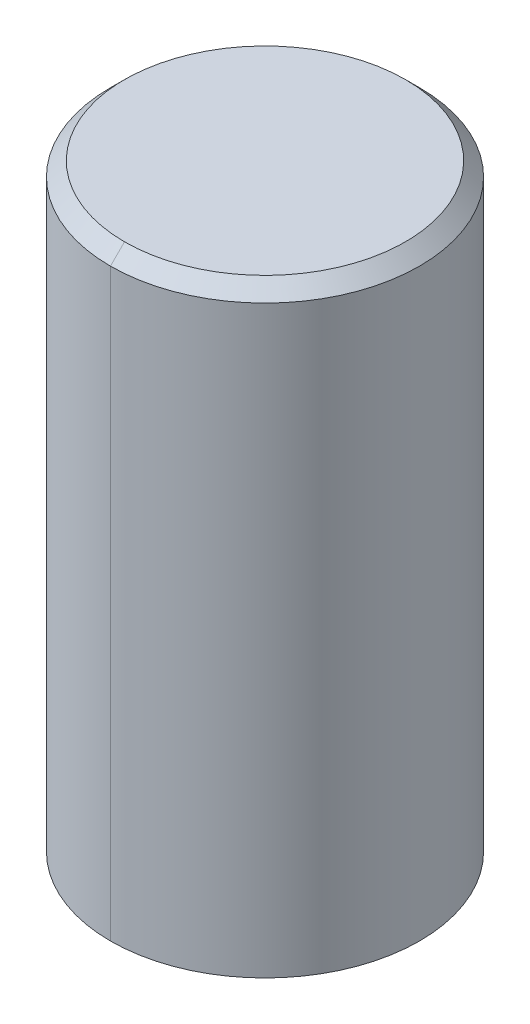
ISO-10303-21;
HEADER;
FILE_DESCRIPTION(('STEP AP214'),'2;1');
FILE_NAME('part.step','',(''),(''),'','','');
FILE_SCHEMA(('AUTOMOTIVE_DESIGN { 1 0 10303 214 1 1 1 1 }'));
ENDSEC;
DATA;
#1=APPLICATION_CONTEXT('core data for automotive mechanical design processes');
#2=APPLICATION_PROTOCOL_DEFINITION('international standard','automotive_design',2000,#1);
#3=PRODUCT_CONTEXT('',#1,'mechanical');
#4=PRODUCT('Part','Part','',(#3));
#5=PRODUCT_RELATED_PRODUCT_CATEGORY('part','',(#4));
#6=PRODUCT_DEFINITION_FORMATION('','',#4);
#7=PRODUCT_DEFINITION_CONTEXT('part definition',#1,'design');
#8=PRODUCT_DEFINITION('design','',#6,#7);
#9=PRODUCT_DEFINITION_SHAPE('','',#8);
#10=(LENGTH_UNIT() NAMED_UNIT(*) SI_UNIT(.MILLI.,.METRE.));
#11=(NAMED_UNIT(*) PLANE_ANGLE_UNIT() SI_UNIT($,.RADIAN.));
#12=(NAMED_UNIT(*) SI_UNIT($,.STERADIAN.) SOLID_ANGLE_UNIT());
#13=UNCERTAINTY_MEASURE_WITH_UNIT(LENGTH_MEASURE(1.E-05),#10,'distance_accuracy_value','');
#14=(GEOMETRIC_REPRESENTATION_CONTEXT(3) GLOBAL_UNCERTAINTY_ASSIGNED_CONTEXT((#13)) GLOBAL_UNIT_ASSIGNED_CONTEXT((#10,
#11,#12)) REPRESENTATION_CONTEXT('',''));
#15=CARTESIAN_POINT('',(0.,0.,0.));
#16=DIRECTION('',(0.,0.,1.));
#17=DIRECTION('',(1.,0.,0.));
#18=AXIS2_PLACEMENT_3D('',#15,#16,#17);
#19=CARTESIAN_POINT('',(0.,5.4102,0.));
#20=DIRECTION('',(0.,-1.,0.));
#21=DIRECTION('',(0.,0.,-1.));
#22=AXIS2_PLACEMENT_3D('',#19,#20,#21);
#23=PLANE('',#22);
#24=CARTESIAN_POINT('',(0.,5.4102,0.));
#25=DIRECTION('',(0.,-1.,0.));
#26=DIRECTION('',(0.,0.,-1.));
#27=AXIS2_PLACEMENT_3D('',#24,#25,#26);
#28=CIRCLE('',#27,1.27);
#29=CARTESIAN_POINT('',(0.,5.4102,1.27));
#30=VERTEX_POINT('',#29);
#31=CARTESIAN_POINT('',(0.,5.4102,-1.27));
#32=VERTEX_POINT('',#31);
#33=EDGE_CURVE('E11',#30,#32,#28,.T.);
#34=ORIENTED_EDGE('',*,*,#33,.F.);
#35=CARTESIAN_POINT('',(0.,5.4102,0.));
#36=DIRECTION('',(0.,-1.,0.));
#37=DIRECTION('',(0.,0.,-1.));
#38=AXIS2_PLACEMENT_3D('',#35,#36,#37);
#39=CIRCLE('',#38,1.27);
#40=EDGE_CURVE('E25',#32,#30,#39,.T.);
#41=ORIENTED_EDGE('',*,*,#40,.F.);
#42=EDGE_LOOP('',(#34,#41));
#43=FACE_BOUND('',#42,.T.);
#44=ADVANCED_FACE('F17',(#43),#23,.F.);
#45=CARTESIAN_POINT('',(0.,5.4102,0.));
#46=DIRECTION('',(0.,-1.,0.));
#47=DIRECTION('',(-1.,0.,0.));
#48=AXIS2_PLACEMENT_3D('',#45,#46,#47);
#49=CONICAL_SURFACE('',#48,1.27,0.78539816339745);
#50=DIRECTION('',(0.,-0.707106781186546,0.707106781186549));
#51=VECTOR('',#50,1.);
#52=CARTESIAN_POINT('',(0.,5.4102,1.27));
#53=LINE('',#52,#51);
#54=CARTESIAN_POINT('',(0.,5.2832,1.397));
#55=VERTEX_POINT('',#54);
#56=EDGE_CURVE('E87',#30,#55,#53,.T.);
#57=ORIENTED_EDGE('',*,*,#56,.T.);
#58=CARTESIAN_POINT('',(0.,5.2832,0.));
#59=DIRECTION('',(0.,-1.,0.));
#60=DIRECTION('',(0.,0.,-1.));
#61=AXIS2_PLACEMENT_3D('',#58,#59,#60);
#62=CIRCLE('',#61,1.397);
#63=CARTESIAN_POINT('',(0.,5.2832,-1.397));
#64=VERTEX_POINT('',#63);
#65=EDGE_CURVE('E63',#64,#55,#62,.T.);
#66=ORIENTED_EDGE('',*,*,#65,.F.);
#67=DIRECTION('',(0.,-0.707106781186546,-0.707106781186549));
#68=VECTOR('',#67,1.);
#69=CARTESIAN_POINT('',(0.,5.4102,-1.27));
#70=LINE('',#69,#68);
#71=EDGE_CURVE('E79',#32,#64,#70,.T.);
#72=ORIENTED_EDGE('',*,*,#71,.F.);
#73=ORIENTED_EDGE('',*,*,#40,.T.);
#74=EDGE_LOOP('',(#57,#66,#72,#73));
#75=FACE_BOUND('',#74,.T.);
#76=ADVANCED_FACE('F96',(#75),#49,.T.);
#77=CARTESIAN_POINT('',(0.,5.4102,0.));
#78=DIRECTION('',(0.,-1.,0.));
#79=DIRECTION('',(1.,0.,0.));
#80=AXIS2_PLACEMENT_3D('',#77,#78,#79);
#81=CONICAL_SURFACE('',#80,1.27,0.78539816339745);
#82=ORIENTED_EDGE('',*,*,#56,.F.);
#83=ORIENTED_EDGE('',*,*,#33,.T.);
#84=ORIENTED_EDGE('',*,*,#71,.T.);
#85=CARTESIAN_POINT('',(0.,5.2832,0.));
#86=DIRECTION('',(0.,-1.,0.));
#87=DIRECTION('',(0.,0.,-1.));
#88=AXIS2_PLACEMENT_3D('',#85,#86,#87);
#89=CIRCLE('',#88,1.397);
#90=EDGE_CURVE('E64',#55,#64,#89,.T.);
#91=ORIENTED_EDGE('',*,*,#90,.F.);
#92=EDGE_LOOP('',(#82,#83,#84,#91));
#93=FACE_BOUND('',#92,.T.);
#94=ADVANCED_FACE('F99',(#93),#81,.T.);
#95=CARTESIAN_POINT('',(0.,0.,0.));
#96=DIRECTION('',(0.,-1.,0.));
#97=DIRECTION('',(1.,0.,0.));
#98=AXIS2_PLACEMENT_3D('',#95,#96,#97);
#99=CYLINDRICAL_SURFACE('',#98,1.397);
#100=DIRECTION('',(0.,-1.,0.));
#101=VECTOR('',#100,1.);
#102=CARTESIAN_POINT('',(0.,5.2832,1.397));
#103=LINE('',#102,#101);
#104=CARTESIAN_POINT('',(0.,0.,1.397));
#105=VERTEX_POINT('',#104);
#106=EDGE_CURVE('E52',#55,#105,#103,.T.);
#107=ORIENTED_EDGE('',*,*,#106,.F.);
#108=ORIENTED_EDGE('',*,*,#90,.T.);
#109=DIRECTION('',(0.,-1.,0.));
#110=VECTOR('',#109,1.);
#111=CARTESIAN_POINT('',(0.,5.2832,-1.397));
#112=LINE('',#111,#110);
#113=CARTESIAN_POINT('',(0.,0.,-1.397));
#114=VERTEX_POINT('',#113);
#115=EDGE_CURVE('E55',#64,#114,#112,.T.);
#116=ORIENTED_EDGE('',*,*,#115,.T.);
#117=CARTESIAN_POINT('',(0.,0.,0.));
#118=DIRECTION('',(0.,-1.,0.));
#119=DIRECTION('',(0.,0.,-1.));
#120=AXIS2_PLACEMENT_3D('',#117,#118,#119);
#121=CIRCLE('',#120,1.397);
#122=EDGE_CURVE('E48',#105,#114,#121,.T.);
#123=ORIENTED_EDGE('',*,*,#122,.F.);
#124=EDGE_LOOP('',(#107,#108,#116,#123));
#125=FACE_BOUND('',#124,.T.);
#126=ADVANCED_FACE('F50',(#125),#99,.T.);
#127=CARTESIAN_POINT('',(1.397,0.,0.));
#128=DIRECTION('',(0.,1.,0.));
#129=DIRECTION('',(0.,0.,1.));
#130=AXIS2_PLACEMENT_3D('',#127,#128,#129);
#131=PLANE('',#130);
#132=CARTESIAN_POINT('',(0.,0.,0.));
#133=DIRECTION('',(0.,-1.,0.));
#134=DIRECTION('',(0.,0.,-1.));
#135=AXIS2_PLACEMENT_3D('',#132,#133,#134);
#136=CIRCLE('',#135,1.397);
#137=EDGE_CURVE('E59',#114,#105,#136,.T.);
#138=ORIENTED_EDGE('',*,*,#137,.T.);
#139=ORIENTED_EDGE('',*,*,#122,.T.);
#140=EDGE_LOOP('',(#138,#139));
#141=FACE_BOUND('',#140,.T.);
#142=ADVANCED_FACE('F66',(#141),#131,.F.);
#143=CARTESIAN_POINT('',(0.,0.,0.));
#144=DIRECTION('',(0.,-1.,0.));
#145=DIRECTION('',(-1.,0.,0.));
#146=AXIS2_PLACEMENT_3D('',#143,#144,#145);
#147=CYLINDRICAL_SURFACE('',#146,1.397);
#148=ORIENTED_EDGE('',*,*,#106,.T.);
#149=ORIENTED_EDGE('',*,*,#137,.F.);
#150=ORIENTED_EDGE('',*,*,#115,.F.);
#151=ORIENTED_EDGE('',*,*,#65,.T.);
#152=EDGE_LOOP('',(#148,#149,#150,#151));
#153=FACE_BOUND('',#152,.T.);
#154=ADVANCED_FACE('F62',(#153),#147,.T.);
#155=CLOSED_SHELL('',(#44,#76,#94,#126,#142,#154));
#156=MANIFOLD_SOLID_BREP('B1',#155);
#157=ADVANCED_BREP_SHAPE_REPRESENTATION('',(#18,#156),#14);
#158=SHAPE_DEFINITION_REPRESENTATION(#9,#157);
ENDSEC;
END-ISO-10303-21;
